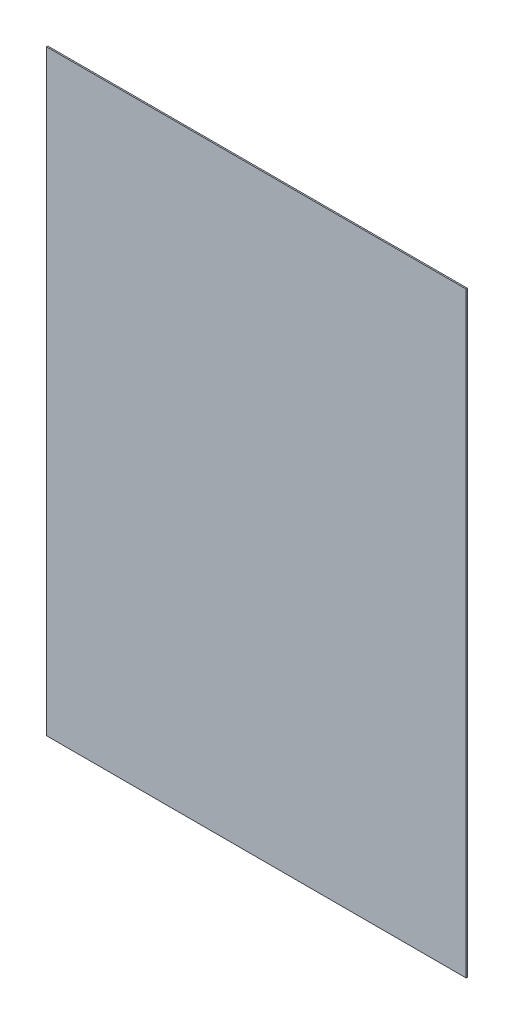
ISO-10303-21;
HEADER;
FILE_DESCRIPTION(('STEP AP214'),'2;1');
FILE_NAME('part.step','',(''),(''),'','','');
FILE_SCHEMA(('AUTOMOTIVE_DESIGN { 1 0 10303 214 1 1 1 1 }'));
ENDSEC;
DATA;
#1=APPLICATION_CONTEXT('core data for automotive mechanical design processes');
#2=APPLICATION_PROTOCOL_DEFINITION('international standard','automotive_design',2000,#1);
#3=PRODUCT_CONTEXT('',#1,'mechanical');
#4=PRODUCT('Part','Part','',(#3));
#5=PRODUCT_RELATED_PRODUCT_CATEGORY('part','',(#4));
#6=PRODUCT_DEFINITION_FORMATION('','',#4);
#7=PRODUCT_DEFINITION_CONTEXT('part definition',#1,'design');
#8=PRODUCT_DEFINITION('design','',#6,#7);
#9=PRODUCT_DEFINITION_SHAPE('','',#8);
#10=(LENGTH_UNIT() NAMED_UNIT(*) SI_UNIT(.MILLI.,.METRE.));
#11=(NAMED_UNIT(*) PLANE_ANGLE_UNIT() SI_UNIT($,.RADIAN.));
#12=(NAMED_UNIT(*) SI_UNIT($,.STERADIAN.) SOLID_ANGLE_UNIT());
#13=UNCERTAINTY_MEASURE_WITH_UNIT(LENGTH_MEASURE(1.E-05),#10,'distance_accuracy_value','');
#14=(GEOMETRIC_REPRESENTATION_CONTEXT(3) GLOBAL_UNCERTAINTY_ASSIGNED_CONTEXT((#13)) GLOBAL_UNIT_ASSIGNED_CONTEXT((#10,
#11,#12)) REPRESENTATION_CONTEXT('',''));
#15=CARTESIAN_POINT('',(0.,0.,0.));
#16=DIRECTION('',(0.,0.,1.));
#17=DIRECTION('',(1.,0.,0.));
#18=AXIS2_PLACEMENT_3D('',#15,#16,#17);
#19=CARTESIAN_POINT('',(0.,0.,2.9));
#20=DIRECTION('',(1.,0.,0.));
#21=DIRECTION('',(0.,1.,0.));
#22=AXIS2_PLACEMENT_3D('',#19,#20,#21);
#23=PLANE('',#22);
#24=DIRECTION('',(0.,-1.,0.));
#25=VECTOR('',#24,1.);
#26=CARTESIAN_POINT('',(0.,0.,0.));
#27=LINE('',#26,#25);
#28=CARTESIAN_POINT('',(0.,0.,0.));
#29=VERTEX_POINT('',#28);
#30=CARTESIAN_POINT('',(1.59204083889156E-13,-1300.,0.));
#31=VERTEX_POINT('',#30);
#32=EDGE_CURVE('E98',#29,#31,#27,.T.);
#33=ORIENTED_EDGE('',*,*,#32,.T.);
#34=DIRECTION('',(0.,0.,-1.));
#35=VECTOR('',#34,1.);
#36=CARTESIAN_POINT('',(1.59204083889156E-13,-1300.,2.9));
#37=LINE('',#36,#35);
#38=CARTESIAN_POINT('',(1.59204083889156E-13,-1300.,2.9));
#39=VERTEX_POINT('',#38);
#40=EDGE_CURVE('E11',#39,#31,#37,.T.);
#41=ORIENTED_EDGE('',*,*,#40,.F.);
#42=DIRECTION('',(0.,-1.,0.));
#43=VECTOR('',#42,1.);
#44=CARTESIAN_POINT('',(0.,0.,2.9));
#45=LINE('',#44,#43);
#46=CARTESIAN_POINT('',(0.,0.,2.9));
#47=VERTEX_POINT('',#46);
#48=EDGE_CURVE('E86',#47,#39,#45,.T.);
#49=ORIENTED_EDGE('',*,*,#48,.F.);
#50=DIRECTION('',(0.,0.,-1.));
#51=VECTOR('',#50,1.);
#52=CARTESIAN_POINT('',(0.,0.,2.9));
#53=LINE('',#52,#51);
#54=EDGE_CURVE('E94',#47,#29,#53,.T.);
#55=ORIENTED_EDGE('',*,*,#54,.T.);
#56=EDGE_LOOP('',(#33,#41,#49,#55));
#57=FACE_BOUND('',#56,.T.);
#58=ADVANCED_FACE('F35',(#57),#23,.F.);
#59=CARTESIAN_POINT('',(1.59204083889156E-13,-1300.,2.9));
#60=DIRECTION('',(0.,1.,0.));
#61=DIRECTION('',(0.,0.,1.));
#62=AXIS2_PLACEMENT_3D('',#59,#60,#61);
#63=PLANE('',#62);
#64=DIRECTION('',(1.,0.,0.));
#65=VECTOR('',#64,1.);
#66=CARTESIAN_POINT('',(1.59204083889156E-13,-1300.,0.));
#67=LINE('',#66,#65);
#68=CARTESIAN_POINT('',(914.3,-1300.,0.));
#69=VERTEX_POINT('',#68);
#70=EDGE_CURVE('E90',#31,#69,#67,.T.);
#71=ORIENTED_EDGE('',*,*,#70,.T.);
#72=DIRECTION('',(0.,0.,-1.));
#73=VECTOR('',#72,1.);
#74=CARTESIAN_POINT('',(914.3,-1300.,2.9));
#75=LINE('',#74,#73);
#76=CARTESIAN_POINT('',(914.3,-1300.,2.9));
#77=VERTEX_POINT('',#76);
#78=EDGE_CURVE('E43',#77,#69,#75,.T.);
#79=ORIENTED_EDGE('',*,*,#78,.F.);
#80=DIRECTION('',(1.,0.,0.));
#81=VECTOR('',#80,1.);
#82=CARTESIAN_POINT('',(1.59204083889156E-13,-1300.,2.9));
#83=LINE('',#82,#81);
#84=EDGE_CURVE('E81',#39,#77,#83,.T.);
#85=ORIENTED_EDGE('',*,*,#84,.F.);
#86=ORIENTED_EDGE('',*,*,#40,.T.);
#87=EDGE_LOOP('',(#71,#79,#85,#86));
#88=FACE_BOUND('',#87,.T.);
#89=ADVANCED_FACE('F89',(#88),#63,.F.);
#90=CARTESIAN_POINT('',(914.3,0.,2.9));
#91=DIRECTION('',(-1.,0.,0.));
#92=DIRECTION('',(0.,-1.,0.));
#93=AXIS2_PLACEMENT_3D('',#90,#91,#92);
#94=PLANE('',#93);
#95=DIRECTION('',(0.,1.,0.));
#96=VECTOR('',#95,1.);
#97=CARTESIAN_POINT('',(914.3,0.,0.));
#98=LINE('',#97,#96);
#99=CARTESIAN_POINT('',(914.3,0.,0.));
#100=VERTEX_POINT('',#99);
#101=EDGE_CURVE('E68',#69,#100,#98,.T.);
#102=ORIENTED_EDGE('',*,*,#101,.T.);
#103=DIRECTION('',(0.,0.,-1.));
#104=VECTOR('',#103,1.);
#105=CARTESIAN_POINT('',(914.3,0.,2.9));
#106=LINE('',#105,#104);
#107=CARTESIAN_POINT('',(914.3,0.,2.9));
#108=VERTEX_POINT('',#107);
#109=EDGE_CURVE('E91',#108,#100,#106,.T.);
#110=ORIENTED_EDGE('',*,*,#109,.F.);
#111=DIRECTION('',(0.,1.,0.));
#112=VECTOR('',#111,1.);
#113=CARTESIAN_POINT('',(914.3,0.,2.9));
#114=LINE('',#113,#112);
#115=EDGE_CURVE('E84',#77,#108,#114,.T.);
#116=ORIENTED_EDGE('',*,*,#115,.F.);
#117=ORIENTED_EDGE('',*,*,#78,.T.);
#118=EDGE_LOOP('',(#102,#110,#116,#117));
#119=FACE_BOUND('',#118,.T.);
#120=ADVANCED_FACE('F92',(#119),#94,.F.);
#121=CARTESIAN_POINT('',(0.,0.,2.9));
#122=DIRECTION('',(0.,-1.,0.));
#123=DIRECTION('',(0.,0.,-1.));
#124=AXIS2_PLACEMENT_3D('',#121,#122,#123);
#125=PLANE('',#124);
#126=DIRECTION('',(-1.,0.,0.));
#127=VECTOR('',#126,1.);
#128=CARTESIAN_POINT('',(0.,0.,0.));
#129=LINE('',#128,#127);
#130=EDGE_CURVE('E74',#100,#29,#129,.T.);
#131=ORIENTED_EDGE('',*,*,#130,.T.);
#132=ORIENTED_EDGE('',*,*,#54,.F.);
#133=DIRECTION('',(-1.,0.,0.));
#134=VECTOR('',#133,1.);
#135=CARTESIAN_POINT('',(0.,0.,2.9));
#136=LINE('',#135,#134);
#137=EDGE_CURVE('E51',#108,#47,#136,.T.);
#138=ORIENTED_EDGE('',*,*,#137,.F.);
#139=ORIENTED_EDGE('',*,*,#109,.T.);
#140=EDGE_LOOP('',(#131,#132,#138,#139));
#141=FACE_BOUND('',#140,.T.);
#142=ADVANCED_FACE('F105',(#141),#125,.F.);
#143=CARTESIAN_POINT('',(0.,0.,2.9));
#144=DIRECTION('',(0.,0.,1.));
#145=DIRECTION('',(1.,0.,0.));
#146=AXIS2_PLACEMENT_3D('',#143,#144,#145);
#147=PLANE('',#146);
#148=ORIENTED_EDGE('',*,*,#48,.T.);
#149=ORIENTED_EDGE('',*,*,#84,.T.);
#150=ORIENTED_EDGE('',*,*,#115,.T.);
#151=ORIENTED_EDGE('',*,*,#137,.T.);
#152=EDGE_LOOP('',(#148,#149,#150,#151));
#153=FACE_BOUND('',#152,.T.);
#154=ADVANCED_FACE('F82',(#153),#147,.T.);
#155=CARTESIAN_POINT('',(0.,0.,0.));
#156=DIRECTION('',(0.,0.,1.));
#157=DIRECTION('',(1.,0.,0.));
#158=AXIS2_PLACEMENT_3D('',#155,#156,#157);
#159=PLANE('',#158);
#160=ORIENTED_EDGE('',*,*,#32,.F.);
#161=ORIENTED_EDGE('',*,*,#130,.F.);
#162=ORIENTED_EDGE('',*,*,#101,.F.);
#163=ORIENTED_EDGE('',*,*,#70,.F.);
#164=EDGE_LOOP('',(#160,#161,#162,#163));
#165=FACE_BOUND('',#164,.T.);
#166=ADVANCED_FACE('F108',(#165),#159,.F.);
#167=CLOSED_SHELL('',(#58,#89,#120,#142,#154,#166));
#168=MANIFOLD_SOLID_BREP('B2',#167);
#169=ADVANCED_BREP_SHAPE_REPRESENTATION('',(#18,#168),#14);
#170=SHAPE_DEFINITION_REPRESENTATION(#9,#169);
ENDSEC;
END-ISO-10303-21;
